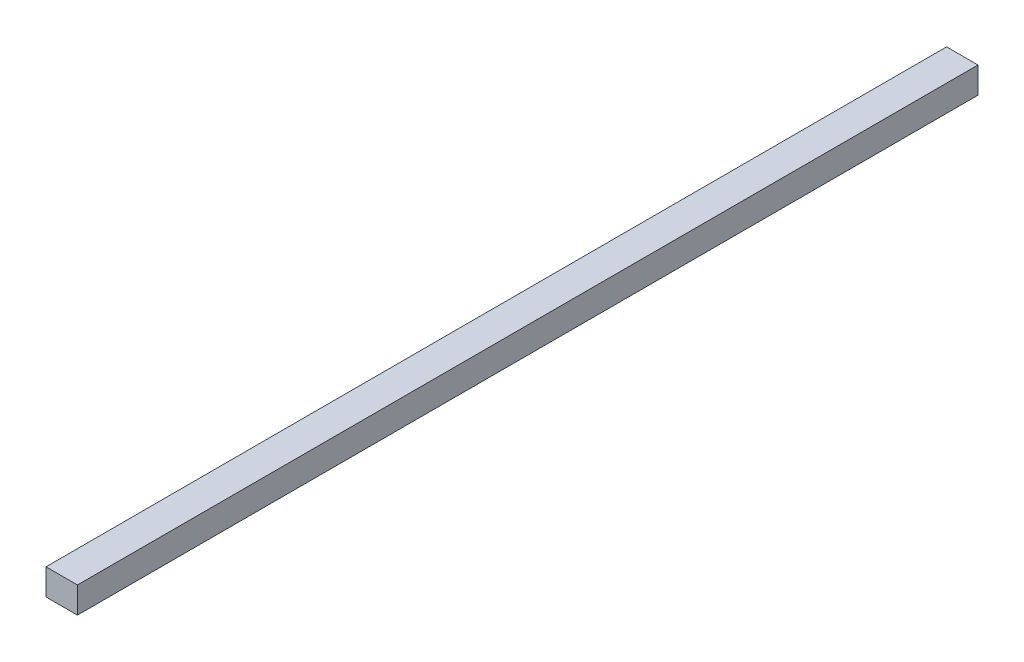
ISO-10303-21;
HEADER;
FILE_DESCRIPTION(('STEP AP214'),'2;1');
FILE_NAME('part.step','',(''),(''),'','','');
FILE_SCHEMA(('AUTOMOTIVE_DESIGN { 1 0 10303 214 1 1 1 1 }'));
ENDSEC;
DATA;
#1=APPLICATION_CONTEXT('core data for automotive mechanical design processes');
#2=APPLICATION_PROTOCOL_DEFINITION('international standard','automotive_design',2000,#1);
#3=PRODUCT_CONTEXT('',#1,'mechanical');
#4=PRODUCT('Part','Part','',(#3));
#5=PRODUCT_RELATED_PRODUCT_CATEGORY('part','',(#4));
#6=PRODUCT_DEFINITION_FORMATION('','',#4);
#7=PRODUCT_DEFINITION_CONTEXT('part definition',#1,'design');
#8=PRODUCT_DEFINITION('design','',#6,#7);
#9=PRODUCT_DEFINITION_SHAPE('','',#8);
#10=(LENGTH_UNIT() NAMED_UNIT(*) SI_UNIT(.MILLI.,.METRE.));
#11=(NAMED_UNIT(*) PLANE_ANGLE_UNIT() SI_UNIT($,.RADIAN.));
#12=(NAMED_UNIT(*) SI_UNIT($,.STERADIAN.) SOLID_ANGLE_UNIT());
#13=UNCERTAINTY_MEASURE_WITH_UNIT(LENGTH_MEASURE(1.E-05),#10,'distance_accuracy_value','');
#14=(GEOMETRIC_REPRESENTATION_CONTEXT(3) GLOBAL_UNCERTAINTY_ASSIGNED_CONTEXT((#13)) GLOBAL_UNIT_ASSIGNED_CONTEXT((#10,
#11,#12)) REPRESENTATION_CONTEXT('',''));
#15=CARTESIAN_POINT('',(0.,0.,0.));
#16=DIRECTION('',(0.,0.,1.));
#17=DIRECTION('',(1.,0.,0.));
#18=AXIS2_PLACEMENT_3D('',#15,#16,#17);
#19=CARTESIAN_POINT('',(0.,0.,344.));
#20=DIRECTION('',(1.,0.,0.));
#21=DIRECTION('',(0.,0.,-1.));
#22=AXIS2_PLACEMENT_3D('',#19,#20,#21);
#23=PLANE('',#22);
#24=DIRECTION('',(0.,-1.,0.));
#25=VECTOR('',#24,1.);
#26=CARTESIAN_POINT('',(0.,0.,0.));
#27=LINE('',#26,#25);
#28=CARTESIAN_POINT('',(0.,10.,0.));
#29=VERTEX_POINT('',#28);
#30=CARTESIAN_POINT('',(0.,0.,0.));
#31=VERTEX_POINT('',#30);
#32=EDGE_CURVE('E96',#29,#31,#27,.T.);
#33=ORIENTED_EDGE('',*,*,#32,.T.);
#34=DIRECTION('',(0.,0.,-1.));
#35=VECTOR('',#34,1.);
#36=CARTESIAN_POINT('',(0.,0.,344.));
#37=LINE('',#36,#35);
#38=CARTESIAN_POINT('',(0.,0.,344.));
#39=VERTEX_POINT('',#38);
#40=EDGE_CURVE('E11',#39,#31,#37,.T.);
#41=ORIENTED_EDGE('',*,*,#40,.F.);
#42=DIRECTION('',(0.,-1.,0.));
#43=VECTOR('',#42,1.);
#44=CARTESIAN_POINT('',(0.,0.,344.));
#45=LINE('',#44,#43);
#46=CARTESIAN_POINT('',(0.,10.,344.));
#47=VERTEX_POINT('',#46);
#48=EDGE_CURVE('E84',#47,#39,#45,.T.);
#49=ORIENTED_EDGE('',*,*,#48,.F.);
#50=DIRECTION('',(0.,0.,-1.));
#51=VECTOR('',#50,1.);
#52=CARTESIAN_POINT('',(0.,10.,344.));
#53=LINE('',#52,#51);
#54=EDGE_CURVE('E92',#47,#29,#53,.T.);
#55=ORIENTED_EDGE('',*,*,#54,.T.);
#56=EDGE_LOOP('',(#33,#41,#49,#55));
#57=FACE_BOUND('',#56,.T.);
#58=ADVANCED_FACE('F33',(#57),#23,.F.);
#59=CARTESIAN_POINT('',(0.,0.,344.));
#60=DIRECTION('',(0.,1.,0.));
#61=DIRECTION('',(0.,0.,1.));
#62=AXIS2_PLACEMENT_3D('',#59,#60,#61);
#63=PLANE('',#62);
#64=DIRECTION('',(1.,0.,0.));
#65=VECTOR('',#64,1.);
#66=CARTESIAN_POINT('',(0.,0.,0.));
#67=LINE('',#66,#65);
#68=CARTESIAN_POINT('',(12.,0.,0.));
#69=VERTEX_POINT('',#68);
#70=EDGE_CURVE('E88',#31,#69,#67,.T.);
#71=ORIENTED_EDGE('',*,*,#70,.T.);
#72=DIRECTION('',(0.,0.,-1.));
#73=VECTOR('',#72,1.);
#74=CARTESIAN_POINT('',(12.,0.,344.));
#75=LINE('',#74,#73);
#76=CARTESIAN_POINT('',(12.,0.,344.));
#77=VERTEX_POINT('',#76);
#78=EDGE_CURVE('E41',#77,#69,#75,.T.);
#79=ORIENTED_EDGE('',*,*,#78,.F.);
#80=DIRECTION('',(1.,0.,0.));
#81=VECTOR('',#80,1.);
#82=CARTESIAN_POINT('',(0.,0.,344.));
#83=LINE('',#82,#81);
#84=EDGE_CURVE('E79',#39,#77,#83,.T.);
#85=ORIENTED_EDGE('',*,*,#84,.F.);
#86=ORIENTED_EDGE('',*,*,#40,.T.);
#87=EDGE_LOOP('',(#71,#79,#85,#86));
#88=FACE_BOUND('',#87,.T.);
#89=ADVANCED_FACE('F87',(#88),#63,.F.);
#90=CARTESIAN_POINT('',(12.,0.,344.));
#91=DIRECTION('',(-1.,0.,0.));
#92=DIRECTION('',(0.,0.,1.));
#93=AXIS2_PLACEMENT_3D('',#90,#91,#92);
#94=PLANE('',#93);
#95=DIRECTION('',(0.,1.,0.));
#96=VECTOR('',#95,1.);
#97=CARTESIAN_POINT('',(12.,0.,0.));
#98=LINE('',#97,#96);
#99=CARTESIAN_POINT('',(12.,10.,0.));
#100=VERTEX_POINT('',#99);
#101=EDGE_CURVE('E66',#69,#100,#98,.T.);
#102=ORIENTED_EDGE('',*,*,#101,.T.);
#103=DIRECTION('',(0.,0.,-1.));
#104=VECTOR('',#103,1.);
#105=CARTESIAN_POINT('',(12.,10.,344.));
#106=LINE('',#105,#104);
#107=CARTESIAN_POINT('',(12.,10.,344.));
#108=VERTEX_POINT('',#107);
#109=EDGE_CURVE('E89',#108,#100,#106,.T.);
#110=ORIENTED_EDGE('',*,*,#109,.F.);
#111=DIRECTION('',(0.,1.,0.));
#112=VECTOR('',#111,1.);
#113=CARTESIAN_POINT('',(12.,0.,344.));
#114=LINE('',#113,#112);
#115=EDGE_CURVE('E82',#77,#108,#114,.T.);
#116=ORIENTED_EDGE('',*,*,#115,.F.);
#117=ORIENTED_EDGE('',*,*,#78,.T.);
#118=EDGE_LOOP('',(#102,#110,#116,#117));
#119=FACE_BOUND('',#118,.T.);
#120=ADVANCED_FACE('F90',(#119),#94,.F.);
#121=CARTESIAN_POINT('',(0.,10.,344.));
#122=DIRECTION('',(0.,-1.,0.));
#123=DIRECTION('',(0.,0.,-1.));
#124=AXIS2_PLACEMENT_3D('',#121,#122,#123);
#125=PLANE('',#124);
#126=DIRECTION('',(-1.,0.,0.));
#127=VECTOR('',#126,1.);
#128=CARTESIAN_POINT('',(0.,10.,0.));
#129=LINE('',#128,#127);
#130=EDGE_CURVE('E72',#100,#29,#129,.T.);
#131=ORIENTED_EDGE('',*,*,#130,.T.);
#132=ORIENTED_EDGE('',*,*,#54,.F.);
#133=DIRECTION('',(-1.,0.,0.));
#134=VECTOR('',#133,1.);
#135=CARTESIAN_POINT('',(0.,10.,344.));
#136=LINE('',#135,#134);
#137=EDGE_CURVE('E49',#108,#47,#136,.T.);
#138=ORIENTED_EDGE('',*,*,#137,.F.);
#139=ORIENTED_EDGE('',*,*,#109,.T.);
#140=EDGE_LOOP('',(#131,#132,#138,#139));
#141=FACE_BOUND('',#140,.T.);
#142=ADVANCED_FACE('F103',(#141),#125,.F.);
#143=CARTESIAN_POINT('',(0.,0.,344.));
#144=DIRECTION('',(0.,0.,-1.));
#145=DIRECTION('',(-1.,0.,0.));
#146=AXIS2_PLACEMENT_3D('',#143,#144,#145);
#147=PLANE('',#146);
#148=ORIENTED_EDGE('',*,*,#48,.T.);
#149=ORIENTED_EDGE('',*,*,#84,.T.);
#150=ORIENTED_EDGE('',*,*,#115,.T.);
#151=ORIENTED_EDGE('',*,*,#137,.T.);
#152=EDGE_LOOP('',(#148,#149,#150,#151));
#153=FACE_BOUND('',#152,.T.);
#154=ADVANCED_FACE('F80',(#153),#147,.F.);
#155=CARTESIAN_POINT('',(0.,0.,0.));
#156=DIRECTION('',(0.,0.,-1.));
#157=DIRECTION('',(-1.,0.,0.));
#158=AXIS2_PLACEMENT_3D('',#155,#156,#157);
#159=PLANE('',#158);
#160=ORIENTED_EDGE('',*,*,#32,.F.);
#161=ORIENTED_EDGE('',*,*,#130,.F.);
#162=ORIENTED_EDGE('',*,*,#101,.F.);
#163=ORIENTED_EDGE('',*,*,#70,.F.);
#164=EDGE_LOOP('',(#160,#161,#162,#163));
#165=FACE_BOUND('',#164,.T.);
#166=ADVANCED_FACE('F106',(#165),#159,.T.);
#167=CLOSED_SHELL('',(#58,#89,#120,#142,#154,#166));
#168=MANIFOLD_SOLID_BREP('B2',#167);
#169=ADVANCED_BREP_SHAPE_REPRESENTATION('',(#18,#168),#14);
#170=SHAPE_DEFINITION_REPRESENTATION(#9,#169);
ENDSEC;
END-ISO-10303-21;
